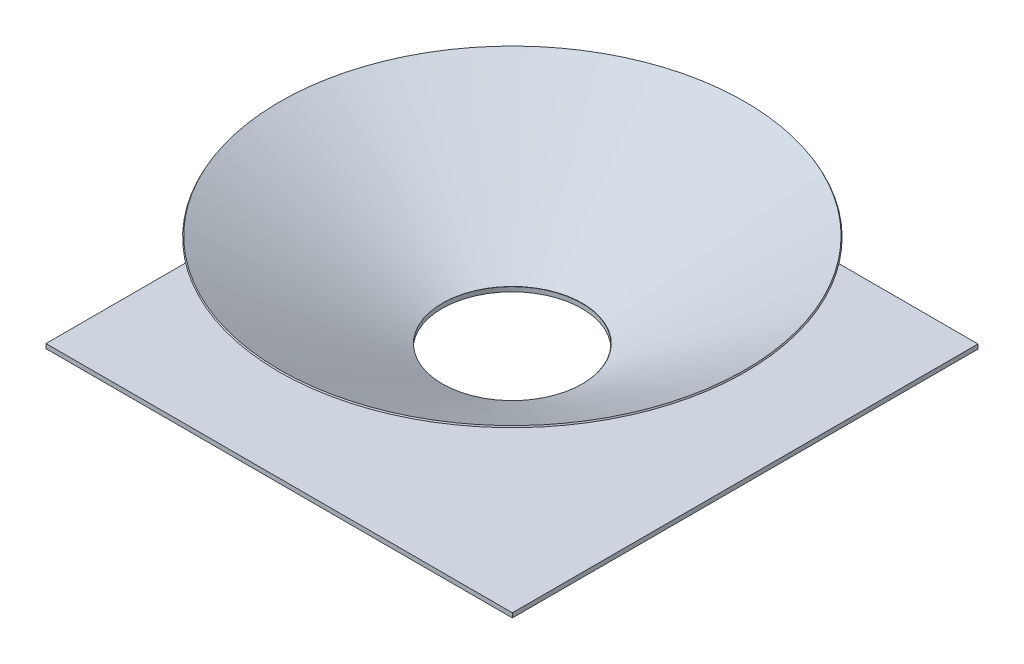
ISO-10303-21;
HEADER;
FILE_DESCRIPTION(('STEP AP214'),'2;1');
FILE_NAME('part.step','',(''),(''),'','','');
FILE_SCHEMA(('AUTOMOTIVE_DESIGN { 1 0 10303 214 1 1 1 1 }'));
ENDSEC;
DATA;
#1=APPLICATION_CONTEXT('core data for automotive mechanical design processes');
#2=APPLICATION_PROTOCOL_DEFINITION('international standard','automotive_design',2000,#1);
#3=PRODUCT_CONTEXT('',#1,'mechanical');
#4=PRODUCT('Part','Part','',(#3));
#5=PRODUCT_RELATED_PRODUCT_CATEGORY('part','',(#4));
#6=PRODUCT_DEFINITION_FORMATION('','',#4);
#7=PRODUCT_DEFINITION_CONTEXT('part definition',#1,'design');
#8=PRODUCT_DEFINITION('design','',#6,#7);
#9=PRODUCT_DEFINITION_SHAPE('','',#8);
#10=(LENGTH_UNIT() NAMED_UNIT(*) SI_UNIT(.MILLI.,.METRE.));
#11=(NAMED_UNIT(*) PLANE_ANGLE_UNIT() SI_UNIT($,.RADIAN.));
#12=(NAMED_UNIT(*) SI_UNIT($,.STERADIAN.) SOLID_ANGLE_UNIT());
#13=UNCERTAINTY_MEASURE_WITH_UNIT(LENGTH_MEASURE(1.E-05),#10,'distance_accuracy_value','');
#14=(GEOMETRIC_REPRESENTATION_CONTEXT(3) GLOBAL_UNCERTAINTY_ASSIGNED_CONTEXT((#13)) GLOBAL_UNIT_ASSIGNED_CONTEXT((#10,
#11,#12)) REPRESENTATION_CONTEXT('',''));
#15=CARTESIAN_POINT('',(0.,0.,0.));
#16=DIRECTION('',(0.,0.,1.));
#17=DIRECTION('',(1.,0.,0.));
#18=AXIS2_PLACEMENT_3D('',#15,#16,#17);
#19=CARTESIAN_POINT('',(-156.25,-3.,156.25));
#20=DIRECTION('',(-1.,0.,0.));
#21=DIRECTION('',(0.,0.,1.));
#22=AXIS2_PLACEMENT_3D('',#19,#20,#21);
#23=PLANE('',#22);
#24=DIRECTION('',(0.,0.,1.));
#25=VECTOR('',#24,1.);
#26=CARTESIAN_POINT('',(-156.25,0.,156.25));
#27=LINE('',#26,#25);
#28=CARTESIAN_POINT('',(-156.25,0.,-155.752153757395));
#29=VERTEX_POINT('',#28);
#30=CARTESIAN_POINT('',(-156.25,0.,156.25));
#31=VERTEX_POINT('',#30);
#32=EDGE_CURVE('E106',#29,#31,#27,.T.);
#33=ORIENTED_EDGE('',*,*,#32,.F.);
#34=DIRECTION('',(0.,1.,0.));
#35=VECTOR('',#34,1.);
#36=CARTESIAN_POINT('',(-156.25,-3.,-155.752153757395));
#37=LINE('',#36,#35);
#38=CARTESIAN_POINT('',(-156.25,-3.,-155.752153757395));
#39=VERTEX_POINT('',#38);
#40=EDGE_CURVE('E12',#39,#29,#37,.T.);
#41=ORIENTED_EDGE('',*,*,#40,.F.);
#42=DIRECTION('',(0.,0.,1.));
#43=VECTOR('',#42,1.);
#44=CARTESIAN_POINT('',(-156.25,-3.,156.25));
#45=LINE('',#44,#43);
#46=CARTESIAN_POINT('',(-156.25,-3.,156.25));
#47=VERTEX_POINT('',#46);
#48=EDGE_CURVE('E99',#39,#47,#45,.T.);
#49=ORIENTED_EDGE('',*,*,#48,.T.);
#50=DIRECTION('',(0.,1.,0.));
#51=VECTOR('',#50,1.);
#52=CARTESIAN_POINT('',(-156.25,-3.,156.25));
#53=LINE('',#52,#51);
#54=EDGE_CURVE('E44',#47,#31,#53,.T.);
#55=ORIENTED_EDGE('',*,*,#54,.T.);
#56=EDGE_LOOP('',(#33,#41,#49,#55));
#57=FACE_BOUND('',#56,.T.);
#58=ADVANCED_FACE('F41',(#57),#23,.T.);
#59=CARTESIAN_POINT('',(-156.25,-3.,-155.752153757395));
#60=DIRECTION('',(0.,0.,-1.));
#61=DIRECTION('',(-1.,0.,0.));
#62=AXIS2_PLACEMENT_3D('',#59,#60,#61);
#63=PLANE('',#62);
#64=DIRECTION('',(-1.,0.,0.));
#65=VECTOR('',#64,1.);
#66=CARTESIAN_POINT('',(-156.25,0.,-155.752153757395));
#67=LINE('',#66,#65);
#68=CARTESIAN_POINT('',(156.25,0.,-155.752153757395));
#69=VERTEX_POINT('',#68);
#70=EDGE_CURVE('E101',#69,#29,#67,.T.);
#71=ORIENTED_EDGE('',*,*,#70,.F.);
#72=DIRECTION('',(0.,1.,0.));
#73=VECTOR('',#72,1.);
#74=CARTESIAN_POINT('',(156.25,-3.,-155.752153757395));
#75=LINE('',#74,#73);
#76=CARTESIAN_POINT('',(156.25,-3.,-155.752153757395));
#77=VERTEX_POINT('',#76);
#78=EDGE_CURVE('E50',#77,#69,#75,.T.);
#79=ORIENTED_EDGE('',*,*,#78,.F.);
#80=DIRECTION('',(-1.,0.,0.));
#81=VECTOR('',#80,1.);
#82=CARTESIAN_POINT('',(-156.25,-3.,-155.752153757395));
#83=LINE('',#82,#81);
#84=EDGE_CURVE('E96',#77,#39,#83,.T.);
#85=ORIENTED_EDGE('',*,*,#84,.T.);
#86=ORIENTED_EDGE('',*,*,#40,.T.);
#87=EDGE_LOOP('',(#71,#79,#85,#86));
#88=FACE_BOUND('',#87,.T.);
#89=ADVANCED_FACE('F117',(#88),#63,.T.);
#90=CARTESIAN_POINT('',(156.25,-3.,156.25));
#91=DIRECTION('',(1.,0.,0.));
#92=DIRECTION('',(0.,0.,-1.));
#93=AXIS2_PLACEMENT_3D('',#90,#91,#92);
#94=PLANE('',#93);
#95=DIRECTION('',(0.,0.,-1.));
#96=VECTOR('',#95,1.);
#97=CARTESIAN_POINT('',(156.25,0.,156.25));
#98=LINE('',#97,#96);
#99=CARTESIAN_POINT('',(156.25,0.,156.25));
#100=VERTEX_POINT('',#99);
#101=EDGE_CURVE('E91',#100,#69,#98,.T.);
#102=ORIENTED_EDGE('',*,*,#101,.F.);
#103=DIRECTION('',(0.,1.,0.));
#104=VECTOR('',#103,1.);
#105=CARTESIAN_POINT('',(156.25,-3.,156.25));
#106=LINE('',#105,#104);
#107=CARTESIAN_POINT('',(156.25,-3.,156.25));
#108=VERTEX_POINT('',#107);
#109=EDGE_CURVE('E86',#108,#100,#106,.T.);
#110=ORIENTED_EDGE('',*,*,#109,.F.);
#111=DIRECTION('',(0.,0.,-1.));
#112=VECTOR('',#111,1.);
#113=CARTESIAN_POINT('',(156.25,-3.,156.25));
#114=LINE('',#113,#112);
#115=EDGE_CURVE('E89',#108,#77,#114,.T.);
#116=ORIENTED_EDGE('',*,*,#115,.T.);
#117=ORIENTED_EDGE('',*,*,#78,.T.);
#118=EDGE_LOOP('',(#102,#110,#116,#117));
#119=FACE_BOUND('',#118,.T.);
#120=ADVANCED_FACE('F88',(#119),#94,.T.);
#121=CARTESIAN_POINT('',(-156.25,-3.,156.25));
#122=DIRECTION('',(0.,0.,1.));
#123=DIRECTION('',(1.,0.,0.));
#124=AXIS2_PLACEMENT_3D('',#121,#122,#123);
#125=PLANE('',#124);
#126=DIRECTION('',(1.,0.,0.));
#127=VECTOR('',#126,1.);
#128=CARTESIAN_POINT('',(-156.25,0.,156.25));
#129=LINE('',#128,#127);
#130=EDGE_CURVE('E109',#31,#100,#129,.T.);
#131=ORIENTED_EDGE('',*,*,#130,.F.);
#132=ORIENTED_EDGE('',*,*,#54,.F.);
#133=DIRECTION('',(1.,0.,0.));
#134=VECTOR('',#133,1.);
#135=CARTESIAN_POINT('',(-156.25,-3.,156.25));
#136=LINE('',#135,#134);
#137=EDGE_CURVE('E95',#47,#108,#136,.T.);
#138=ORIENTED_EDGE('',*,*,#137,.T.);
#139=ORIENTED_EDGE('',*,*,#109,.T.);
#140=EDGE_LOOP('',(#131,#132,#138,#139));
#141=FACE_BOUND('',#140,.T.);
#142=ADVANCED_FACE('F98',(#141),#125,.T.);
#143=CARTESIAN_POINT('',(0.,-3.,0.));
#144=DIRECTION('',(0.,-1.,0.));
#145=DIRECTION('',(0.,0.,-1.));
#146=AXIS2_PLACEMENT_3D('',#143,#144,#145);
#147=PLANE('',#146);
#148=CARTESIAN_POINT('',(0.,-3.,0.24892312130248));
#149=DIRECTION('',(0.,1.,0.));
#150=DIRECTION('',(0.,0.,1.));
#151=AXIS2_PLACEMENT_3D('',#148,#149,#150);
#152=CIRCLE('',#151,46.875);
#153=CARTESIAN_POINT('',(0.,-3.,47.1239231213025));
#154=VERTEX_POINT('',#153);
#155=EDGE_CURVE('E110',#154,#154,#152,.T.);
#156=ORIENTED_EDGE('',*,*,#155,.T.);
#157=EDGE_LOOP('',(#156));
#158=FACE_BOUND('',#157,.T.);
#159=ORIENTED_EDGE('',*,*,#48,.F.);
#160=ORIENTED_EDGE('',*,*,#84,.F.);
#161=ORIENTED_EDGE('',*,*,#115,.F.);
#162=ORIENTED_EDGE('',*,*,#137,.F.);
#163=EDGE_LOOP('',(#159,#160,#161,#162));
#164=FACE_BOUND('',#163,.T.);
#165=ADVANCED_FACE('F94',(#158,#164),#147,.T.);
#166=CARTESIAN_POINT('',(0.,0.,0.));
#167=DIRECTION('',(0.,-1.,0.));
#168=DIRECTION('',(0.,0.,-1.));
#169=AXIS2_PLACEMENT_3D('',#166,#167,#168);
#170=PLANE('',#169);
#171=CARTESIAN_POINT('',(0.,0.,0.24892312130248));
#172=DIRECTION('',(0.,1.,0.));
#173=DIRECTION('',(0.,0.,1.));
#174=AXIS2_PLACEMENT_3D('',#171,#172,#173);
#175=CIRCLE('',#174,46.875);
#176=CARTESIAN_POINT('',(0.,0.,47.1239231213025));
#177=VERTEX_POINT('',#176);
#178=EDGE_CURVE('E147',#177,#177,#175,.T.);
#179=ORIENTED_EDGE('',*,*,#178,.F.);
#180=EDGE_LOOP('',(#179));
#181=FACE_BOUND('',#180,.T.);
#182=ORIENTED_EDGE('',*,*,#32,.T.);
#183=ORIENTED_EDGE('',*,*,#130,.T.);
#184=ORIENTED_EDGE('',*,*,#101,.T.);
#185=ORIENTED_EDGE('',*,*,#70,.T.);
#186=EDGE_LOOP('',(#182,#183,#184,#185));
#187=FACE_BOUND('',#186,.T.);
#188=ADVANCED_FACE('F116',(#181,#187),#170,.F.);
#189=CARTESIAN_POINT('',(0.,-3.,0.24892312130248));
#190=DIRECTION('',(0.,1.,0.));
#191=DIRECTION('',(0.,0.,1.));
#192=AXIS2_PLACEMENT_3D('',#189,#190,#191);
#193=CYLINDRICAL_SURFACE('',#192,46.875);
#194=ORIENTED_EDGE('',*,*,#155,.F.);
#195=EDGE_LOOP('',(#194));
#196=FACE_BOUND('',#195,.T.);
#197=ORIENTED_EDGE('',*,*,#178,.T.);
#198=EDGE_LOOP('',(#197));
#199=FACE_BOUND('',#198,.T.);
#200=ADVANCED_FACE('F135',(#196,#199),#193,.F.);
#201=CLOSED_SHELL('',(#58,#89,#120,#142,#165,#188,#200));
#202=MANIFOLD_SOLID_BREP('B2',#201);
#203=CARTESIAN_POINT('',(-48.8836522994883,0.,0.));
#204=DIRECTION('',(0.,1.,0.));
#205=DIRECTION('',(0.,0.,1.));
#206=AXIS2_PLACEMENT_3D('',#203,#204,#205);
#207=PLANE('',#206);
#208=CARTESIAN_POINT('',(0.,0.,0.));
#209=DIRECTION('',(0.,-1.,0.));
#210=DIRECTION('',(0.,0.,-1.));
#211=AXIS2_PLACEMENT_3D('',#208,#209,#210);
#212=CIRCLE('',#211,46.875);
#213=CARTESIAN_POINT('',(0.,0.,46.875));
#214=VERTEX_POINT('',#213);
#215=EDGE_CURVE('E40',#214,#214,#212,.T.);
#216=ORIENTED_EDGE('',*,*,#215,.F.);
#217=EDGE_LOOP('',(#216));
#218=FACE_BOUND('',#217,.T.);
#219=CARTESIAN_POINT('',(0.,0.,0.));
#220=DIRECTION('',(0.,-1.,0.));
#221=DIRECTION('',(0.,0.,-1.));
#222=AXIS2_PLACEMENT_3D('',#219,#220,#221);
#223=CIRCLE('',#222,48.8836522994883);
#224=CARTESIAN_POINT('',(0.,0.,48.8836522994883));
#225=VERTEX_POINT('',#224);
#226=EDGE_CURVE('E200',#225,#225,#223,.T.);
#227=ORIENTED_EDGE('',*,*,#226,.T.);
#228=EDGE_LOOP('',(#227));
#229=FACE_BOUND('',#228,.T.);
#230=ADVANCED_FACE('F186',(#218,#229),#207,.F.);
#231=CARTESIAN_POINT('',(0.,0.,0.));
#232=DIRECTION('',(0.,1.,0.));
#233=DIRECTION('',(0.,0.,1.));
#234=AXIS2_PLACEMENT_3D('',#231,#232,#233);
#235=CONICAL_SURFACE('',#234,46.875,1.04968271570928);
#236=CARTESIAN_POINT('',(0.,62.5,0.));
#237=DIRECTION('',(0.,-1.,0.));
#238=DIRECTION('',(0.,0.,-1.));
#239=AXIS2_PLACEMENT_3D('',#236,#237,#238);
#240=CIRCLE('',#239,155.752153757395);
#241=CARTESIAN_POINT('',(0.,62.5,155.752153757395));
#242=VERTEX_POINT('',#241);
#243=EDGE_CURVE('E192',#242,#242,#240,.T.);
#244=CARTESIAN_POINT('',(0.,62.5,155.752153757395));
#245=CARTESIAN_POINT('',(0.,61.8489583333333,154.618016739089));
#246=CARTESIAN_POINT('',(0.,61.1979166666667,153.483879720783));
#247=CARTESIAN_POINT('',(0.,59.8958333333333,151.21560568417));
#248=CARTESIAN_POINT('',(0.,59.2447916666667,150.081468665864));
#249=CARTESIAN_POINT('',(0.,57.9427083333333,147.813194629252));
#250=CARTESIAN_POINT('',(0.,57.2916666666667,146.679057610945));
#251=CARTESIAN_POINT('',(0.,55.9895833333333,144.410783574333));
#252=CARTESIAN_POINT('',(0.,55.3385416666667,143.276646556027));
#253=CARTESIAN_POINT('',(0.,54.0364583333333,141.008372519414));
#254=CARTESIAN_POINT('',(0.,53.3854166666667,139.874235501108));
#255=CARTESIAN_POINT('',(0.,52.0833333333333,137.605961464496));
#256=CARTESIAN_POINT('',(0.,51.4322916666667,136.47182444619));
#257=CARTESIAN_POINT('',(0.,50.1302083333333,134.203550409577));
#258=CARTESIAN_POINT('',(0.,49.4791666666667,133.069413391271));
#259=CARTESIAN_POINT('',(0.,48.1770833333333,130.801139354659));
#260=CARTESIAN_POINT('',(0.,47.5260416666667,129.667002336353));
#261=CARTESIAN_POINT('',(0.,46.2239583333333,127.39872829974));
#262=CARTESIAN_POINT('',(0.,45.5729166666667,126.264591281434));
#263=CARTESIAN_POINT('',(0.,44.2708333333333,123.996317244821));
#264=CARTESIAN_POINT('',(0.,43.6197916666667,122.862180226515));
#265=CARTESIAN_POINT('',(0.,42.3177083333333,120.593906189903));
#266=CARTESIAN_POINT('',(0.,41.6666666666667,119.459769171597));
#267=CARTESIAN_POINT('',(0.,40.3645833333333,117.191495134984));
#268=CARTESIAN_POINT('',(0.,39.7135416666667,116.057358116678));
#269=CARTESIAN_POINT('',(0.,38.4114583333333,113.789084080066));
#270=CARTESIAN_POINT('',(0.,37.7604166666667,112.65494706176));
#271=CARTESIAN_POINT('',(0.,36.4583333333333,110.386673025147));
#272=CARTESIAN_POINT('',(0.,35.8072916666667,109.252536006841));
#273=CARTESIAN_POINT('',(0.,34.5052083333333,106.984261970229));
#274=CARTESIAN_POINT('',(0.,33.8541666666667,105.850124951922));
#275=CARTESIAN_POINT('',(0.,32.5520833333333,103.58185091531));
#276=CARTESIAN_POINT('',(0.,31.9010416666667,102.447713897004));
#277=CARTESIAN_POINT('',(0.,30.5989583333333,100.179439860391));
#278=CARTESIAN_POINT('',(0.,29.9479166666667,99.0453028420851));
#279=CARTESIAN_POINT('',(0.,28.6458333333333,96.7770288054727));
#280=CARTESIAN_POINT('',(0.,27.9947916666667,95.6428917871665));
#281=CARTESIAN_POINT('',(0.,26.6927083333333,93.3746177505541));
#282=CARTESIAN_POINT('',(0.,26.0416666666667,92.2404807322479));
#283=CARTESIAN_POINT('',(0.,24.7395833333333,89.9722066956355));
#284=CARTESIAN_POINT('',(0.,24.0885416666667,88.8380696773294));
#285=CARTESIAN_POINT('',(0.,22.7864583333333,86.569795640717));
#286=CARTESIAN_POINT('',(0.,22.1354166666667,85.4356586224107));
#287=CARTESIAN_POINT('',(0.,20.8333333333333,83.1673845857983));
#288=CARTESIAN_POINT('',(0.,20.1822916666667,82.0332475674922));
#289=CARTESIAN_POINT('',(0.,18.8802083333333,79.7649735308798));
#290=CARTESIAN_POINT('',(0.,18.2291666666667,78.6308365125736));
#291=CARTESIAN_POINT('',(0.,16.9270833333333,76.3625624759612));
#292=CARTESIAN_POINT('',(0.,16.2760416666667,75.228425457655));
#293=CARTESIAN_POINT('',(0.,14.9739583333333,72.9601514210426));
#294=CARTESIAN_POINT('',(0.,14.3229166666667,71.8260144027364));
#295=CARTESIAN_POINT('',(0.,13.0208333333333,69.557740366124));
#296=CARTESIAN_POINT('',(0.,12.3697916666667,68.4236033478178));
#297=CARTESIAN_POINT('',(0.,11.0677083333333,66.1553293112054));
#298=CARTESIAN_POINT('',(0.,10.4166666666667,65.0211922928992));
#299=CARTESIAN_POINT('',(0.,9.11458333333333,62.7529182562868));
#300=CARTESIAN_POINT('',(0.,8.46354166666667,61.6187812379806));
#301=CARTESIAN_POINT('',(0.,7.16145833333333,59.3505072013682));
#302=CARTESIAN_POINT('',(0.,6.51041666666667,58.216370183062));
#303=CARTESIAN_POINT('',(0.,5.20833333333333,55.9480961464496));
#304=CARTESIAN_POINT('',(0.,4.55729166666667,54.8139591281434));
#305=CARTESIAN_POINT('',(0.,3.25520833333333,52.545685091531));
#306=CARTESIAN_POINT('',(0.,2.60416666666667,51.4115480732248));
#307=CARTESIAN_POINT('',(0.,1.30208333333333,49.1432740366124));
#308=CARTESIAN_POINT('',(0.,0.651041666666666,48.0091370183062));
#309=CARTESIAN_POINT('',(0.,0.,46.875));
#310=B_SPLINE_CURVE_WITH_KNOTS('',3,(#244,#245,#246,#247,#248,#249,#250,#251,#252,#253,#254,
#255,#256,#257,#258,#259,#260,#261,#262,#263,#264,#265,#266,#267,#268,#269,#270,#271,#272,#273,
#274,#275,#276,#277,#278,#279,#280,#281,#282,#283,#284,#285,#286,#287,#288,#289,#290,#291,#292,
#293,#294,#295,#296,#297,#298,#299,#300,#301,#302,#303,#304,#305,#306,#307,#308,#309),
.UNSPECIFIED.,.F.,.F.,(4,2,2,2,2,2,2,2,2,2,2,2,2,2,2,2,2,2,2,2,2,2,2,2,2,2,2,2,2,2,2,2,4),(0.,
3.9231490224381,7.84629804487626,11.7694470673144,15.6925960897525,19.6157451121906,
23.5388941346288,27.4620431570669,31.385192179505,35.3083412019432,39.2314902243813,
43.1546392468194,47.0777882692576,51.0009372916957,54.9240863141338,58.847235336572,
62.7703843590101,66.6935333814482,70.6166824038864,74.5398314263245,78.4629804487626,
82.3861294712007,86.3092784936389,90.232427516077,94.1555765385151,98.0787255609533,
102.001874583391,105.92502360583,109.848172628268,113.771321650706,117.694470673144,
121.617619695582,125.54076871802),.UNSPECIFIED.);
#311=EDGE_CURVE('BSEAM215',#242,#214,#310,.T.);
#312=ORIENTED_EDGE('',*,*,#243,.F.);
#313=ORIENTED_EDGE('',*,*,#215,.T.);
#314=ORIENTED_EDGE('',*,*,#311,.T.);
#315=ORIENTED_EDGE('',*,*,#311,.F.);
#316=EDGE_LOOP('',(#312,#314,#313,#315));
#317=FACE_BOUND('',#316,.T.);
#318=ADVANCED_FACE('F215',(#317),#235,.F.);
#319=CARTESIAN_POINT('',(0.,62.5,0.));
#320=DIRECTION('',(0.,-1.,0.));
#321=DIRECTION('',(0.,0.,-1.));
#322=AXIS2_PLACEMENT_3D('',#319,#320,#321);
#323=CONICAL_SURFACE('',#322,155.752153757395,0.521113611085622);
#324=CARTESIAN_POINT('',(0.,61.6327346895418,0.));
#325=DIRECTION('',(0.,-1.,0.));
#326=DIRECTION('',(0.,0.,-1.));
#327=AXIS2_PLACEMENT_3D('',#324,#325,#326);
#328=CIRCLE('',#327,156.25);
#329=CARTESIAN_POINT('',(0.,61.6327346895418,156.25));
#330=VERTEX_POINT('',#329);
#331=EDGE_CURVE('E196',#330,#330,#328,.T.);
#332=ORIENTED_EDGE('',*,*,#331,.F.);
#333=EDGE_LOOP('',(#332));
#334=FACE_BOUND('',#333,.T.);
#335=ORIENTED_EDGE('',*,*,#243,.T.);
#336=EDGE_LOOP('',(#335));
#337=FACE_BOUND('',#336,.T.);
#338=ADVANCED_FACE('F210',(#334,#337),#323,.T.);
#339=CARTESIAN_POINT('',(0.,61.6327346895418,0.));
#340=DIRECTION('',(0.,1.,0.));
#341=DIRECTION('',(0.,0.,1.));
#342=AXIS2_PLACEMENT_3D('',#339,#340,#341);
#343=CONICAL_SURFACE('',#342,156.25,1.04968271570928);
#344=CARTESIAN_POINT('',(0.,0.,48.8836522994883));
#345=CARTESIAN_POINT('',(0.,0.642007653016068,50.002051754702));
#346=CARTESIAN_POINT('',(0.,1.28401530603213,51.1204512099156));
#347=CARTESIAN_POINT('',(0.,2.56803061206425,53.357250120343));
#348=CARTESIAN_POINT('',(0.,3.21003826508031,54.4756495755566));
#349=CARTESIAN_POINT('',(0.,4.49405357111243,56.7124484859839));
#350=CARTESIAN_POINT('',(0.,5.13606122412849,57.8308479411976));
#351=CARTESIAN_POINT('',(0.,6.42007653016061,60.0676468516249));
#352=CARTESIAN_POINT('',(0.,7.06208418317667,61.1860463068386));
#353=CARTESIAN_POINT('',(0.,8.34609948920879,63.4228452172659));
#354=CARTESIAN_POINT('',(0.,8.98810714222485,64.5412446724796));
#355=CARTESIAN_POINT('',(0.,10.272122448257,66.7780435829069));
#356=CARTESIAN_POINT('',(0.,10.914130101273,67.8964430381206));
#357=CARTESIAN_POINT('',(0.,12.1981454073052,70.1332419485479));
#358=CARTESIAN_POINT('',(0.,12.8401530603212,71.2516414037616));
#359=CARTESIAN_POINT('',(0.,14.1241683663533,73.4884403141889));
#360=CARTESIAN_POINT('',(0.,14.7661760193694,74.6068397694026));
#361=CARTESIAN_POINT('',(0.,16.0501913254015,76.8436386798299));
#362=CARTESIAN_POINT('',(0.,16.6921989784176,77.9620381350436));
#363=CARTESIAN_POINT('',(0.,17.9762142844497,80.1988370454709));
#364=CARTESIAN_POINT('',(0.,18.6182219374658,81.3172365006845));
#365=CARTESIAN_POINT('',(0.,19.9022372434979,83.5540354111119));
#366=CARTESIAN_POINT('',(0.,20.5442448965139,84.6724348663255));
#367=CARTESIAN_POINT('',(0.,21.8282602025461,86.9092337767529));
#368=CARTESIAN_POINT('',(0.,22.4702678555621,88.0276332319665));
#369=CARTESIAN_POINT('',(0.,23.7542831615942,90.2644321423939));
#370=CARTESIAN_POINT('',(0.,24.3962908146103,91.3828315976075));
#371=CARTESIAN_POINT('',(0.,25.6803061206424,93.6196305080348));
#372=CARTESIAN_POINT('',(0.,26.3223137736585,94.7380299632485));
#373=CARTESIAN_POINT('',(0.,27.6063290796906,96.9748288736758));
#374=CARTESIAN_POINT('',(0.,28.2483367327067,98.0932283288895));
#375=CARTESIAN_POINT('',(0.,29.5323520387388,100.330027239317));
#376=CARTESIAN_POINT('',(0.,30.1743596917548,101.44842669453));
#377=CARTESIAN_POINT('',(0.,31.458374997787,103.685225604958));
#378=CARTESIAN_POINT('',(0.,32.100382650803,104.803625060171));
#379=CARTESIAN_POINT('',(0.,33.3843979568351,107.040423970599));
#380=CARTESIAN_POINT('',(0.,34.0264056098512,108.158823425812));
#381=CARTESIAN_POINT('',(0.,35.3104209158833,110.39562233624));
#382=CARTESIAN_POINT('',(0.,35.9524285688994,111.514021791453));
#383=CARTESIAN_POINT('',(0.,37.2364438749315,113.750820701881));
#384=CARTESIAN_POINT('',(0.,37.8784515279476,114.869220157094));
#385=CARTESIAN_POINT('',(0.,39.1624668339797,117.106019067522));
#386=CARTESIAN_POINT('',(0.,39.8044744869958,118.224418522735));
#387=CARTESIAN_POINT('',(0.,41.0884897930279,120.461217433163));
#388=CARTESIAN_POINT('',(0.,41.7304974460439,121.579616888376));
#389=CARTESIAN_POINT('',(0.,43.014512752076,123.816415798804));
#390=CARTESIAN_POINT('',(0.,43.6565204050921,124.934815254017));
#391=CARTESIAN_POINT('',(0.,44.9405357111242,127.171614164445));
#392=CARTESIAN_POINT('',(0.,45.5825433641403,128.290013619658));
#393=CARTESIAN_POINT('',(0.,46.8665586701724,130.526812530086));
#394=CARTESIAN_POINT('',(0.,47.5085663231885,131.645211985299));
#395=CARTESIAN_POINT('',(0.,48.7925816292206,133.882010895727));
#396=CARTESIAN_POINT('',(0.,49.4345892822367,135.00041035094));
#397=CARTESIAN_POINT('',(0.,50.7186045882688,137.237209261368));
#398=CARTESIAN_POINT('',(0.,51.3606122412848,138.355608716581));
#399=CARTESIAN_POINT('',(0.,52.644627547317,140.592407627009));
#400=CARTESIAN_POINT('',(0.,53.286635200333,141.710807082222));
#401=CARTESIAN_POINT('',(0.,54.5706505063651,143.94760599265));
#402=CARTESIAN_POINT('',(0.,55.2126581593812,145.066005447863));
#403=CARTESIAN_POINT('',(0.,56.4966734654133,147.302804358291));
#404=CARTESIAN_POINT('',(0.,57.1386811184294,148.421203813504));
#405=CARTESIAN_POINT('',(0.,58.4226964244615,150.658002723932));
#406=CARTESIAN_POINT('',(0.,59.0647040774776,151.776402179145));
#407=CARTESIAN_POINT('',(0.,60.3487193835097,154.013201089573));
#408=CARTESIAN_POINT('',(0.,60.9907270365257,155.131600544786));
#409=CARTESIAN_POINT('',(0.,61.6327346895418,156.25));
#410=B_SPLINE_CURVE_WITH_KNOTS('',3,(#344,#345,#346,#347,#348,#349,#350,#351,#352,#353,#354,
#355,#356,#357,#358,#359,#360,#361,#362,#363,#364,#365,#366,#367,#368,#369,#370,#371,#372,#373,
#374,#375,#376,#377,#378,#379,#380,#381,#382,#383,#384,#385,#386,#387,#388,#389,#390,#391,#392,
#393,#394,#395,#396,#397,#398,#399,#400,#401,#402,#403,#404,#405,#406,#407,#408,#409),
.UNSPECIFIED.,.F.,.F.,(4,2,2,2,2,2,2,2,2,2,2,2,2,2,2,2,2,2,2,2,2,2,2,2,2,2,2,2,2,2,2,2,4),(0.,
3.86871044555944,7.73742089111887,11.6061313366783,15.4748417822377,19.3435522277972,
23.2122626733566,27.0809731189161,30.9496835644755,34.8183940100349,38.6871044555943,
42.5558149011538,46.4245253467132,50.2932357922727,54.1619462378321,58.0306566833915,
61.899367128951,65.7680775745104,69.6367880200698,73.5054984656293,77.3742089111887,
81.2429193567481,85.1116298023076,88.980340247867,92.8490506934264,96.7177611389859,
100.586471584545,104.455182030105,108.323892475664,112.192602921224,116.061313366783,
119.930023812342,123.798734257902),.UNSPECIFIED.);
#411=EDGE_CURVE('BSEAM207',#225,#330,#410,.T.);
#412=ORIENTED_EDGE('',*,*,#226,.F.);
#413=ORIENTED_EDGE('',*,*,#331,.T.);
#414=ORIENTED_EDGE('',*,*,#411,.T.);
#415=ORIENTED_EDGE('',*,*,#411,.F.);
#416=EDGE_LOOP('',(#412,#414,#413,#415));
#417=FACE_BOUND('',#416,.T.);
#418=ADVANCED_FACE('F207',(#417),#343,.T.);
#419=CLOSED_SHELL('',(#230,#318,#338,#418));
#420=MANIFOLD_SOLID_BREP('B6',#419);
#421=ADVANCED_BREP_SHAPE_REPRESENTATION('',(#18,#202,#420),#14);
#422=SHAPE_DEFINITION_REPRESENTATION(#9,#421);
ENDSEC;
END-ISO-10303-21;
